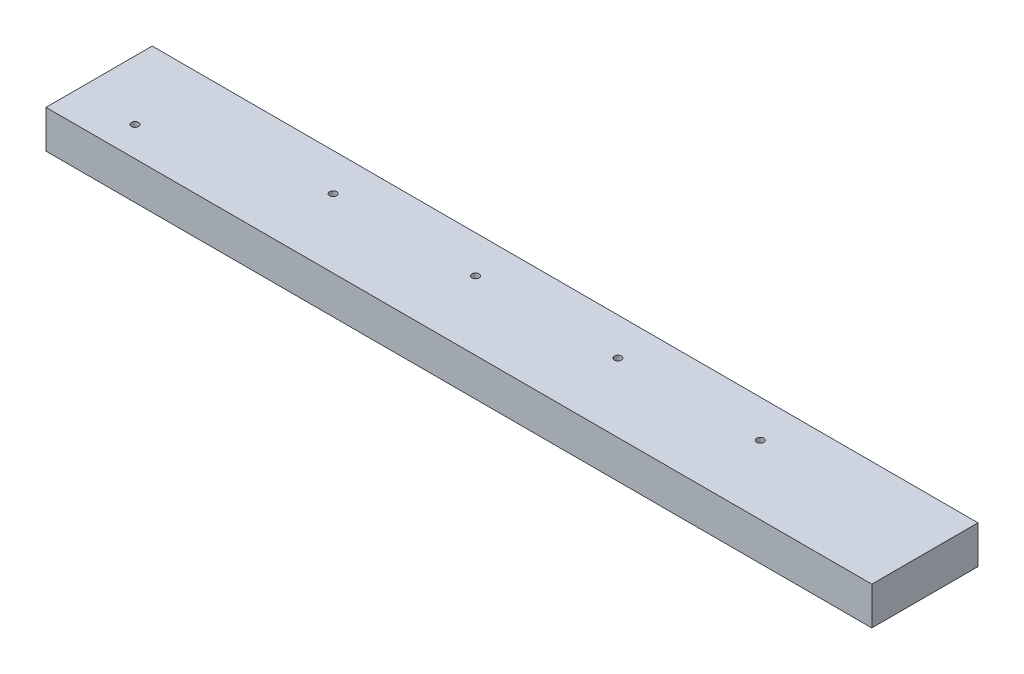
ISO-10303-21;
HEADER;
FILE_DESCRIPTION(('STEP AP214'),'2;1');
FILE_NAME('part.step','',(''),(''),'','','');
FILE_SCHEMA(('AUTOMOTIVE_DESIGN { 1 0 10303 214 1 1 1 1 }'));
ENDSEC;
DATA;
#1=APPLICATION_CONTEXT('core data for automotive mechanical design processes');
#2=APPLICATION_PROTOCOL_DEFINITION('international standard','automotive_design',2000,#1);
#3=PRODUCT_CONTEXT('',#1,'mechanical');
#4=PRODUCT('Part','Part','',(#3));
#5=PRODUCT_RELATED_PRODUCT_CATEGORY('part','',(#4));
#6=PRODUCT_DEFINITION_FORMATION('','',#4);
#7=PRODUCT_DEFINITION_CONTEXT('part definition',#1,'design');
#8=PRODUCT_DEFINITION('design','',#6,#7);
#9=PRODUCT_DEFINITION_SHAPE('','',#8);
#10=(LENGTH_UNIT() NAMED_UNIT(*) SI_UNIT(.MILLI.,.METRE.));
#11=(NAMED_UNIT(*) PLANE_ANGLE_UNIT() SI_UNIT($,.RADIAN.));
#12=(NAMED_UNIT(*) SI_UNIT($,.STERADIAN.) SOLID_ANGLE_UNIT());
#13=UNCERTAINTY_MEASURE_WITH_UNIT(LENGTH_MEASURE(1.E-05),#10,'distance_accuracy_value','');
#14=(GEOMETRIC_REPRESENTATION_CONTEXT(3) GLOBAL_UNCERTAINTY_ASSIGNED_CONTEXT((#13)) GLOBAL_UNIT_ASSIGNED_CONTEXT((#10,
#11,#12)) REPRESENTATION_CONTEXT('',''));
#15=CARTESIAN_POINT('',(0.,0.,0.));
#16=DIRECTION('',(0.,0.,1.));
#17=DIRECTION('',(1.,0.,0.));
#18=AXIS2_PLACEMENT_3D('',#15,#16,#17);
#19=CARTESIAN_POINT('',(-1104.9,50.8,-142.08125));
#20=DIRECTION('',(1.,0.,0.));
#21=DIRECTION('',(0.,0.,-1.));
#22=AXIS2_PLACEMENT_3D('',#19,#20,#21);
#23=PLANE('',#22);
#24=DIRECTION('',(0.,0.,1.));
#25=VECTOR('',#24,1.);
#26=CARTESIAN_POINT('',(-1104.9,-50.8,-142.08125));
#27=LINE('',#26,#25);
#28=CARTESIAN_POINT('',(-1104.9,-50.8,-142.08125));
#29=VERTEX_POINT('',#28);
#30=CARTESIAN_POINT('',(-1104.9,-50.8,142.08125));
#31=VERTEX_POINT('',#30);
#32=EDGE_CURVE('E217',#29,#31,#27,.T.);
#33=ORIENTED_EDGE('',*,*,#32,.T.);
#34=DIRECTION('',(0.,-1.,0.));
#35=VECTOR('',#34,1.);
#36=CARTESIAN_POINT('',(-1104.9,50.8,142.08125));
#37=LINE('',#36,#35);
#38=CARTESIAN_POINT('',(-1104.9,50.8,142.08125));
#39=VERTEX_POINT('',#38);
#40=EDGE_CURVE('E11',#39,#31,#37,.T.);
#41=ORIENTED_EDGE('',*,*,#40,.F.);
#42=DIRECTION('',(0.,0.,1.));
#43=VECTOR('',#42,1.);
#44=CARTESIAN_POINT('',(-1104.9,50.8,-142.08125));
#45=LINE('',#44,#43);
#46=CARTESIAN_POINT('',(-1104.9,50.8,-142.08125));
#47=VERTEX_POINT('',#46);
#48=EDGE_CURVE('E220',#47,#39,#45,.T.);
#49=ORIENTED_EDGE('',*,*,#48,.F.);
#50=DIRECTION('',(0.,-1.,0.));
#51=VECTOR('',#50,1.);
#52=CARTESIAN_POINT('',(-1104.9,50.8,-142.08125));
#53=LINE('',#52,#51);
#54=EDGE_CURVE('E230',#47,#29,#53,.T.);
#55=ORIENTED_EDGE('',*,*,#54,.T.);
#56=EDGE_LOOP('',(#33,#41,#49,#55));
#57=FACE_BOUND('',#56,.T.);
#58=ADVANCED_FACE('F33',(#57),#23,.F.);
#59=CARTESIAN_POINT('',(1104.9,50.8,142.08125));
#60=DIRECTION('',(0.,0.,-1.));
#61=DIRECTION('',(-1.,0.,0.));
#62=AXIS2_PLACEMENT_3D('',#59,#60,#61);
#63=PLANE('',#62);
#64=DIRECTION('',(1.,0.,0.));
#65=VECTOR('',#64,1.);
#66=CARTESIAN_POINT('',(1104.9,-50.8,142.08125));
#67=LINE('',#66,#65);
#68=CARTESIAN_POINT('',(1104.9,-50.8,142.08125));
#69=VERTEX_POINT('',#68);
#70=EDGE_CURVE('E233',#31,#69,#67,.T.);
#71=ORIENTED_EDGE('',*,*,#70,.T.);
#72=DIRECTION('',(0.,-1.,0.));
#73=VECTOR('',#72,1.);
#74=CARTESIAN_POINT('',(1104.9,50.8,142.08125));
#75=LINE('',#74,#73);
#76=CARTESIAN_POINT('',(1104.9,50.8,142.08125));
#77=VERTEX_POINT('',#76);
#78=EDGE_CURVE('E40',#77,#69,#75,.T.);
#79=ORIENTED_EDGE('',*,*,#78,.F.);
#80=DIRECTION('',(1.,0.,0.));
#81=VECTOR('',#80,1.);
#82=CARTESIAN_POINT('',(1104.9,50.8,142.08125));
#83=LINE('',#82,#81);
#84=EDGE_CURVE('E223',#39,#77,#83,.T.);
#85=ORIENTED_EDGE('',*,*,#84,.F.);
#86=ORIENTED_EDGE('',*,*,#40,.T.);
#87=EDGE_LOOP('',(#71,#79,#85,#86));
#88=FACE_BOUND('',#87,.T.);
#89=ADVANCED_FACE('F263',(#88),#63,.F.);
#90=CARTESIAN_POINT('',(1104.9,50.8,-142.08125));
#91=DIRECTION('',(-1.,0.,0.));
#92=DIRECTION('',(0.,0.,1.));
#93=AXIS2_PLACEMENT_3D('',#90,#91,#92);
#94=PLANE('',#93);
#95=DIRECTION('',(0.,0.,-1.));
#96=VECTOR('',#95,1.);
#97=CARTESIAN_POINT('',(1104.9,-50.8,-142.08125));
#98=LINE('',#97,#96);
#99=CARTESIAN_POINT('',(1104.9,-50.8,-142.08125));
#100=VERTEX_POINT('',#99);
#101=EDGE_CURVE('E235',#69,#100,#98,.T.);
#102=ORIENTED_EDGE('',*,*,#101,.T.);
#103=DIRECTION('',(0.,-1.,0.));
#104=VECTOR('',#103,1.);
#105=CARTESIAN_POINT('',(1104.9,50.8,-142.08125));
#106=LINE('',#105,#104);
#107=CARTESIAN_POINT('',(1104.9,50.8,-142.08125));
#108=VERTEX_POINT('',#107);
#109=EDGE_CURVE('E240',#108,#100,#106,.T.);
#110=ORIENTED_EDGE('',*,*,#109,.F.);
#111=DIRECTION('',(0.,0.,-1.));
#112=VECTOR('',#111,1.);
#113=CARTESIAN_POINT('',(1104.9,50.8,-142.08125));
#114=LINE('',#113,#112);
#115=EDGE_CURVE('E226',#77,#108,#114,.T.);
#116=ORIENTED_EDGE('',*,*,#115,.F.);
#117=ORIENTED_EDGE('',*,*,#78,.T.);
#118=EDGE_LOOP('',(#102,#110,#116,#117));
#119=FACE_BOUND('',#118,.T.);
#120=ADVANCED_FACE('F247',(#119),#94,.F.);
#121=CARTESIAN_POINT('',(1104.9,50.8,-142.08125));
#122=DIRECTION('',(0.,0.,1.));
#123=DIRECTION('',(1.,0.,0.));
#124=AXIS2_PLACEMENT_3D('',#121,#122,#123);
#125=PLANE('',#124);
#126=DIRECTION('',(-1.,0.,0.));
#127=VECTOR('',#126,1.);
#128=CARTESIAN_POINT('',(1104.9,-50.8,-142.08125));
#129=LINE('',#128,#127);
#130=EDGE_CURVE('E224',#100,#29,#129,.T.);
#131=ORIENTED_EDGE('',*,*,#130,.T.);
#132=ORIENTED_EDGE('',*,*,#54,.F.);
#133=DIRECTION('',(-1.,0.,0.));
#134=VECTOR('',#133,1.);
#135=CARTESIAN_POINT('',(1104.9,50.8,-142.08125));
#136=LINE('',#135,#134);
#137=EDGE_CURVE('E228',#108,#47,#136,.T.);
#138=ORIENTED_EDGE('',*,*,#137,.F.);
#139=ORIENTED_EDGE('',*,*,#109,.T.);
#140=EDGE_LOOP('',(#131,#132,#138,#139));
#141=FACE_BOUND('',#140,.T.);
#142=ADVANCED_FACE('F256',(#141),#125,.F.);
#143=CARTESIAN_POINT('',(0.,50.8,0.));
#144=DIRECTION('',(0.,-1.,0.));
#145=DIRECTION('',(0.,0.,-1.));
#146=AXIS2_PLACEMENT_3D('',#143,#144,#145);
#147=PLANE('',#146);
#148=CARTESIAN_POINT('',(-520.7,50.8,-42.0687500000002));
#149=DIRECTION('',(0.,1.,0.));
#150=DIRECTION('',(0.,0.,1.));
#151=AXIS2_PLACEMENT_3D('',#148,#149,#150);
#152=CIRCLE('',#151,9.52500000000002);
#153=CARTESIAN_POINT('',(-520.7,50.8,-32.5437500000002));
#154=VERTEX_POINT('',#153);
#155=EDGE_CURVE('E194',#154,#154,#152,.T.);
#156=ORIENTED_EDGE('',*,*,#155,.F.);
#157=EDGE_LOOP('',(#156));
#158=FACE_BOUND('',#157,.T.);
#159=CARTESIAN_POINT('',(-139.7,50.8,-42.0687500000002));
#160=DIRECTION('',(0.,1.,0.));
#161=DIRECTION('',(0.,0.,1.));
#162=AXIS2_PLACEMENT_3D('',#159,#160,#161);
#163=CIRCLE('',#162,9.52500000000002);
#164=CARTESIAN_POINT('',(-139.7,50.8,-32.5437500000002));
#165=VERTEX_POINT('',#164);
#166=EDGE_CURVE('E200',#165,#165,#163,.T.);
#167=ORIENTED_EDGE('',*,*,#166,.F.);
#168=EDGE_LOOP('',(#167));
#169=FACE_BOUND('',#168,.T.);
#170=CARTESIAN_POINT('',(241.3,50.8,-42.0687500000002));
#171=DIRECTION('',(0.,1.,0.));
#172=DIRECTION('',(0.,0.,1.));
#173=AXIS2_PLACEMENT_3D('',#170,#171,#172);
#174=CIRCLE('',#173,9.52500000000002);
#175=CARTESIAN_POINT('',(241.3,50.8,-32.5437500000002));
#176=VERTEX_POINT('',#175);
#177=EDGE_CURVE('E206',#176,#176,#174,.T.);
#178=ORIENTED_EDGE('',*,*,#177,.F.);
#179=EDGE_LOOP('',(#178));
#180=FACE_BOUND('',#179,.T.);
#181=CARTESIAN_POINT('',(622.3,50.8,-42.0687500000002));
#182=DIRECTION('',(0.,1.,0.));
#183=DIRECTION('',(0.,0.,1.));
#184=AXIS2_PLACEMENT_3D('',#181,#182,#183);
#185=CIRCLE('',#184,9.52500000000002);
#186=CARTESIAN_POINT('',(622.3,50.8,-32.5437500000002));
#187=VERTEX_POINT('',#186);
#188=EDGE_CURVE('E184',#187,#187,#185,.T.);
#189=ORIENTED_EDGE('',*,*,#188,.F.);
#190=EDGE_LOOP('',(#189));
#191=FACE_BOUND('',#190,.T.);
#192=CARTESIAN_POINT('',(-946.15,50.8,62.7062499999998));
#193=DIRECTION('',(0.,1.,0.));
#194=DIRECTION('',(0.,0.,1.));
#195=AXIS2_PLACEMENT_3D('',#192,#193,#194);
#196=CIRCLE('',#195,9.52500000000002);
#197=CARTESIAN_POINT('',(-946.15,50.8,72.2312499999998));
#198=VERTEX_POINT('',#197);
#199=EDGE_CURVE('E193',#198,#198,#196,.T.);
#200=ORIENTED_EDGE('',*,*,#199,.F.);
#201=EDGE_LOOP('',(#200));
#202=FACE_BOUND('',#201,.T.);
#203=ORIENTED_EDGE('',*,*,#48,.T.);
#204=ORIENTED_EDGE('',*,*,#84,.T.);
#205=ORIENTED_EDGE('',*,*,#115,.T.);
#206=ORIENTED_EDGE('',*,*,#137,.T.);
#207=EDGE_LOOP('',(#203,#204,#205,#206));
#208=FACE_BOUND('',#207,.T.);
#209=ADVANCED_FACE('F262',(#158,#169,#180,#191,#202,#208),#147,.F.);
#210=CARTESIAN_POINT('',(0.,-50.8,0.));
#211=DIRECTION('',(0.,-1.,0.));
#212=DIRECTION('',(0.,0.,-1.));
#213=AXIS2_PLACEMENT_3D('',#210,#211,#212);
#214=PLANE('',#213);
#215=DIRECTION('',(0.,0.,1.));
#216=VECTOR('',#215,1.);
#217=CARTESIAN_POINT('',(-619.125,-50.8,-69.0562500000085));
#218=LINE('',#217,#216);
#219=CARTESIAN_POINT('',(-619.125,-50.8,-113.506250000008));
#220=VERTEX_POINT('',#219);
#221=CARTESIAN_POINT('',(-619.125,-50.8,-69.0562500000085));
#222=VERTEX_POINT('',#221);
#223=EDGE_CURVE('E47',#220,#222,#218,.T.);
#224=ORIENTED_EDGE('',*,*,#223,.F.);
#225=DIRECTION('',(1.,0.,0.));
#226=VECTOR('',#225,1.);
#227=CARTESIAN_POINT('',(-704.85,-50.8,-113.506250000008));
#228=LINE('',#227,#226);
#229=CARTESIAN_POINT('',(-704.85,-50.8,-113.506250000008));
#230=VERTEX_POINT('',#229);
#231=EDGE_CURVE('E141',#230,#220,#228,.T.);
#232=ORIENTED_EDGE('',*,*,#231,.F.);
#233=DIRECTION('',(0.,0.,-1.));
#234=VECTOR('',#233,1.);
#235=CARTESIAN_POINT('',(-704.85,-50.8,-69.0562500000085));
#236=LINE('',#235,#234);
#237=CARTESIAN_POINT('',(-704.85,-50.8,-69.0562500000085));
#238=VERTEX_POINT('',#237);
#239=EDGE_CURVE('E144',#238,#230,#236,.T.);
#240=ORIENTED_EDGE('',*,*,#239,.F.);
#241=DIRECTION('',(-1.,0.,0.));
#242=VECTOR('',#241,1.);
#243=CARTESIAN_POINT('',(-704.85,-50.8,-69.0562500000085));
#244=LINE('',#243,#242);
#245=EDGE_CURVE('E150',#222,#238,#244,.T.);
#246=ORIENTED_EDGE('',*,*,#245,.F.);
#247=EDGE_LOOP('',(#224,#232,#240,#246));
#248=FACE_BOUND('',#247,.T.);
#249=DIRECTION('',(0.,0.,1.));
#250=VECTOR('',#249,1.);
#251=CARTESIAN_POINT('',(574.675,-50.8,-69.0562500000001));
#252=LINE('',#251,#250);
#253=CARTESIAN_POINT('',(574.675,-50.8,-113.50625));
#254=VERTEX_POINT('',#253);
#255=CARTESIAN_POINT('',(574.675,-50.8,-69.0562500000001));
#256=VERTEX_POINT('',#255);
#257=EDGE_CURVE('E55',#254,#256,#252,.T.);
#258=ORIENTED_EDGE('',*,*,#257,.F.);
#259=DIRECTION('',(1.,0.,0.));
#260=VECTOR('',#259,1.);
#261=CARTESIAN_POINT('',(488.95,-50.8,-113.50625));
#262=LINE('',#261,#260);
#263=CARTESIAN_POINT('',(488.95,-50.8,-113.50625));
#264=VERTEX_POINT('',#263);
#265=EDGE_CURVE('E163',#264,#254,#262,.T.);
#266=ORIENTED_EDGE('',*,*,#265,.F.);
#267=DIRECTION('',(0.,0.,-1.));
#268=VECTOR('',#267,1.);
#269=CARTESIAN_POINT('',(488.95,-50.8,-69.0562500000001));
#270=LINE('',#269,#268);
#271=CARTESIAN_POINT('',(488.95,-50.8,-69.0562500000001));
#272=VERTEX_POINT('',#271);
#273=EDGE_CURVE('E177',#272,#264,#270,.T.);
#274=ORIENTED_EDGE('',*,*,#273,.F.);
#275=DIRECTION('',(-1.,0.,0.));
#276=VECTOR('',#275,1.);
#277=CARTESIAN_POINT('',(488.95,-50.8,-69.0562500000001));
#278=LINE('',#277,#276);
#279=EDGE_CURVE('E174',#256,#272,#278,.T.);
#280=ORIENTED_EDGE('',*,*,#279,.F.);
#281=EDGE_LOOP('',(#258,#266,#274,#280));
#282=FACE_BOUND('',#281,.T.);
#283=CARTESIAN_POINT('',(-520.7,-50.8,-42.0687500000002));
#284=DIRECTION('',(0.,1.,0.));
#285=DIRECTION('',(0.,0.,1.));
#286=AXIS2_PLACEMENT_3D('',#283,#284,#285);
#287=CIRCLE('',#286,9.52500000000002);
#288=CARTESIAN_POINT('',(-520.7,-50.8,-32.5437500000002));
#289=VERTEX_POINT('',#288);
#290=EDGE_CURVE('E190',#289,#289,#287,.T.);
#291=ORIENTED_EDGE('',*,*,#290,.T.);
#292=EDGE_LOOP('',(#291));
#293=FACE_BOUND('',#292,.T.);
#294=CARTESIAN_POINT('',(-139.7,-50.8,-42.0687500000002));
#295=DIRECTION('',(0.,1.,0.));
#296=DIRECTION('',(0.,0.,1.));
#297=AXIS2_PLACEMENT_3D('',#294,#295,#296);
#298=CIRCLE('',#297,9.52500000000002);
#299=CARTESIAN_POINT('',(-139.7,-50.8,-32.5437500000002));
#300=VERTEX_POINT('',#299);
#301=EDGE_CURVE('E197',#300,#300,#298,.T.);
#302=ORIENTED_EDGE('',*,*,#301,.T.);
#303=EDGE_LOOP('',(#302));
#304=FACE_BOUND('',#303,.T.);
#305=CARTESIAN_POINT('',(241.3,-50.8,-42.0687500000002));
#306=DIRECTION('',(0.,1.,0.));
#307=DIRECTION('',(0.,0.,1.));
#308=AXIS2_PLACEMENT_3D('',#305,#306,#307);
#309=CIRCLE('',#308,9.52500000000002);
#310=CARTESIAN_POINT('',(241.3,-50.8,-32.5437500000002));
#311=VERTEX_POINT('',#310);
#312=EDGE_CURVE('E203',#311,#311,#309,.T.);
#313=ORIENTED_EDGE('',*,*,#312,.T.);
#314=EDGE_LOOP('',(#313));
#315=FACE_BOUND('',#314,.T.);
#316=CARTESIAN_POINT('',(622.3,-50.8,-42.0687500000002));
#317=DIRECTION('',(0.,1.,0.));
#318=DIRECTION('',(0.,0.,1.));
#319=AXIS2_PLACEMENT_3D('',#316,#317,#318);
#320=CIRCLE('',#319,9.52500000000002);
#321=CARTESIAN_POINT('',(622.3,-50.8,-32.5437500000002));
#322=VERTEX_POINT('',#321);
#323=EDGE_CURVE('E209',#322,#322,#320,.T.);
#324=ORIENTED_EDGE('',*,*,#323,.T.);
#325=EDGE_LOOP('',(#324));
#326=FACE_BOUND('',#325,.T.);
#327=CARTESIAN_POINT('',(-946.15,-50.8,62.7062499999998));
#328=DIRECTION('',(0.,1.,0.));
#329=DIRECTION('',(0.,0.,1.));
#330=AXIS2_PLACEMENT_3D('',#327,#328,#329);
#331=CIRCLE('',#330,9.52500000000002);
#332=CARTESIAN_POINT('',(-946.15,-50.8,72.2312499999998));
#333=VERTEX_POINT('',#332);
#334=EDGE_CURVE('E214',#333,#333,#331,.T.);
#335=ORIENTED_EDGE('',*,*,#334,.T.);
#336=EDGE_LOOP('',(#335));
#337=FACE_BOUND('',#336,.T.);
#338=ORIENTED_EDGE('',*,*,#32,.F.);
#339=ORIENTED_EDGE('',*,*,#130,.F.);
#340=ORIENTED_EDGE('',*,*,#101,.F.);
#341=ORIENTED_EDGE('',*,*,#70,.F.);
#342=EDGE_LOOP('',(#338,#339,#340,#341));
#343=FACE_BOUND('',#342,.T.);
#344=ADVANCED_FACE('F253',(#248,#282,#293,#304,#315,#326,#337,#343),#214,.T.);
#345=CARTESIAN_POINT('',(-946.15,-50.8,62.7062499999998));
#346=DIRECTION('',(0.,1.,0.));
#347=DIRECTION('',(0.,0.,1.));
#348=AXIS2_PLACEMENT_3D('',#345,#346,#347);
#349=CYLINDRICAL_SURFACE('',#348,9.52500000000002);
#350=ORIENTED_EDGE('',*,*,#334,.F.);
#351=EDGE_LOOP('',(#350));
#352=FACE_BOUND('',#351,.T.);
#353=ORIENTED_EDGE('',*,*,#199,.T.);
#354=EDGE_LOOP('',(#353));
#355=FACE_BOUND('',#354,.T.);
#356=ADVANCED_FACE('F275',(#352,#355),#349,.F.);
#357=CARTESIAN_POINT('',(622.3,-50.8,-42.0687500000002));
#358=DIRECTION('',(0.,1.,0.));
#359=DIRECTION('',(0.,0.,1.));
#360=AXIS2_PLACEMENT_3D('',#357,#358,#359);
#361=CYLINDRICAL_SURFACE('',#360,9.52500000000002);
#362=ORIENTED_EDGE('',*,*,#323,.F.);
#363=EDGE_LOOP('',(#362));
#364=FACE_BOUND('',#363,.T.);
#365=ORIENTED_EDGE('',*,*,#188,.T.);
#366=EDGE_LOOP('',(#365));
#367=FACE_BOUND('',#366,.T.);
#368=ADVANCED_FACE('F282',(#364,#367),#361,.F.);
#369=CARTESIAN_POINT('',(241.3,-50.8,-42.0687500000002));
#370=DIRECTION('',(0.,1.,0.));
#371=DIRECTION('',(0.,0.,1.));
#372=AXIS2_PLACEMENT_3D('',#369,#370,#371);
#373=CYLINDRICAL_SURFACE('',#372,9.52500000000002);
#374=ORIENTED_EDGE('',*,*,#312,.F.);
#375=EDGE_LOOP('',(#374));
#376=FACE_BOUND('',#375,.T.);
#377=ORIENTED_EDGE('',*,*,#177,.T.);
#378=EDGE_LOOP('',(#377));
#379=FACE_BOUND('',#378,.T.);
#380=ADVANCED_FACE('F286',(#376,#379),#373,.F.);
#381=CARTESIAN_POINT('',(-139.7,-50.8,-42.0687500000002));
#382=DIRECTION('',(0.,1.,0.));
#383=DIRECTION('',(0.,0.,1.));
#384=AXIS2_PLACEMENT_3D('',#381,#382,#383);
#385=CYLINDRICAL_SURFACE('',#384,9.52500000000002);
#386=ORIENTED_EDGE('',*,*,#301,.F.);
#387=EDGE_LOOP('',(#386));
#388=FACE_BOUND('',#387,.T.);
#389=ORIENTED_EDGE('',*,*,#166,.T.);
#390=EDGE_LOOP('',(#389));
#391=FACE_BOUND('',#390,.T.);
#392=ADVANCED_FACE('F290',(#388,#391),#385,.F.);
#393=CARTESIAN_POINT('',(-520.7,-50.8,-42.0687500000002));
#394=DIRECTION('',(0.,1.,0.));
#395=DIRECTION('',(0.,0.,1.));
#396=AXIS2_PLACEMENT_3D('',#393,#394,#395);
#397=CYLINDRICAL_SURFACE('',#396,9.52500000000002);
#398=ORIENTED_EDGE('',*,*,#290,.F.);
#399=EDGE_LOOP('',(#398));
#400=FACE_BOUND('',#399,.T.);
#401=ORIENTED_EDGE('',*,*,#155,.T.);
#402=EDGE_LOOP('',(#401));
#403=FACE_BOUND('',#402,.T.);
#404=ADVANCED_FACE('F294',(#400,#403),#397,.F.);
#405=CARTESIAN_POINT('',(574.675,-25.4,-69.0562500000001));
#406=DIRECTION('',(1.,0.,0.));
#407=DIRECTION('',(0.,0.,-1.));
#408=AXIS2_PLACEMENT_3D('',#405,#406,#407);
#409=PLANE('',#408);
#410=ORIENTED_EDGE('',*,*,#257,.T.);
#411=DIRECTION('',(0.,-1.,0.));
#412=VECTOR('',#411,1.);
#413=CARTESIAN_POINT('',(574.675,-25.4,-69.0562500000001));
#414=LINE('',#413,#412);
#415=CARTESIAN_POINT('',(574.675,-25.4,-69.0562500000001));
#416=VERTEX_POINT('',#415);
#417=EDGE_CURVE('E172',#416,#256,#414,.T.);
#418=ORIENTED_EDGE('',*,*,#417,.F.);
#419=DIRECTION('',(0.,0.,1.));
#420=VECTOR('',#419,1.);
#421=CARTESIAN_POINT('',(574.675,-25.4,-69.0562500000001));
#422=LINE('',#421,#420);
#423=CARTESIAN_POINT('',(574.675,-25.4,-113.50625));
#424=VERTEX_POINT('',#423);
#425=EDGE_CURVE('E159',#424,#416,#422,.T.);
#426=ORIENTED_EDGE('',*,*,#425,.F.);
#427=DIRECTION('',(0.,-1.,0.));
#428=VECTOR('',#427,1.);
#429=CARTESIAN_POINT('',(574.675,-25.4,-113.50625));
#430=LINE('',#429,#428);
#431=EDGE_CURVE('E182',#424,#254,#430,.T.);
#432=ORIENTED_EDGE('',*,*,#431,.T.);
#433=EDGE_LOOP('',(#410,#418,#426,#432));
#434=FACE_BOUND('',#433,.T.);
#435=ADVANCED_FACE('F298',(#434),#409,.F.);
#436=CARTESIAN_POINT('',(488.95,-25.4,-113.50625));
#437=DIRECTION('',(0.,0.,-1.));
#438=DIRECTION('',(-1.,0.,0.));
#439=AXIS2_PLACEMENT_3D('',#436,#437,#438);
#440=PLANE('',#439);
#441=ORIENTED_EDGE('',*,*,#265,.T.);
#442=ORIENTED_EDGE('',*,*,#431,.F.);
#443=DIRECTION('',(1.,0.,0.));
#444=VECTOR('',#443,1.);
#445=CARTESIAN_POINT('',(488.95,-25.4,-113.50625));
#446=LINE('',#445,#444);
#447=CARTESIAN_POINT('',(488.95,-25.4,-113.50625));
#448=VERTEX_POINT('',#447);
#449=EDGE_CURVE('E169',#448,#424,#446,.T.);
#450=ORIENTED_EDGE('',*,*,#449,.F.);
#451=DIRECTION('',(0.,-1.,0.));
#452=VECTOR('',#451,1.);
#453=CARTESIAN_POINT('',(488.95,-25.4,-113.50625));
#454=LINE('',#453,#452);
#455=EDGE_CURVE('E185',#448,#264,#454,.T.);
#456=ORIENTED_EDGE('',*,*,#455,.T.);
#457=EDGE_LOOP('',(#441,#442,#450,#456));
#458=FACE_BOUND('',#457,.T.);
#459=ADVANCED_FACE('F302',(#458),#440,.F.);
#460=CARTESIAN_POINT('',(488.95,-25.4,-69.0562500000001));
#461=DIRECTION('',(-1.,0.,0.));
#462=DIRECTION('',(0.,0.,1.));
#463=AXIS2_PLACEMENT_3D('',#460,#461,#462);
#464=PLANE('',#463);
#465=ORIENTED_EDGE('',*,*,#273,.T.);
#466=ORIENTED_EDGE('',*,*,#455,.F.);
#467=DIRECTION('',(0.,0.,-1.));
#468=VECTOR('',#467,1.);
#469=CARTESIAN_POINT('',(488.95,-25.4,-69.0562500000001));
#470=LINE('',#469,#468);
#471=CARTESIAN_POINT('',(488.95,-25.4,-69.0562500000001));
#472=VERTEX_POINT('',#471);
#473=EDGE_CURVE('E166',#472,#448,#470,.T.);
#474=ORIENTED_EDGE('',*,*,#473,.F.);
#475=DIRECTION('',(0.,-1.,0.));
#476=VECTOR('',#475,1.);
#477=CARTESIAN_POINT('',(488.95,-25.4,-69.0562500000001));
#478=LINE('',#477,#476);
#479=EDGE_CURVE('E187',#472,#272,#478,.T.);
#480=ORIENTED_EDGE('',*,*,#479,.T.);
#481=EDGE_LOOP('',(#465,#466,#474,#480));
#482=FACE_BOUND('',#481,.T.);
#483=ADVANCED_FACE('F307',(#482),#464,.F.);
#484=CARTESIAN_POINT('',(488.95,-25.4,-69.0562500000001));
#485=DIRECTION('',(0.,0.,1.));
#486=DIRECTION('',(1.,0.,0.));
#487=AXIS2_PLACEMENT_3D('',#484,#485,#486);
#488=PLANE('',#487);
#489=ORIENTED_EDGE('',*,*,#279,.T.);
#490=ORIENTED_EDGE('',*,*,#479,.F.);
#491=DIRECTION('',(-1.,0.,0.));
#492=VECTOR('',#491,1.);
#493=CARTESIAN_POINT('',(488.95,-25.4,-69.0562500000001));
#494=LINE('',#493,#492);
#495=EDGE_CURVE('E162',#416,#472,#494,.T.);
#496=ORIENTED_EDGE('',*,*,#495,.F.);
#497=ORIENTED_EDGE('',*,*,#417,.T.);
#498=EDGE_LOOP('',(#489,#490,#496,#497));
#499=FACE_BOUND('',#498,.T.);
#500=ADVANCED_FACE('F303',(#499),#488,.F.);
#501=CARTESIAN_POINT('',(0.,-25.4,0.));
#502=DIRECTION('',(0.,-1.,0.));
#503=DIRECTION('',(0.,0.,-1.));
#504=AXIS2_PLACEMENT_3D('',#501,#502,#503);
#505=PLANE('',#504);
#506=ORIENTED_EDGE('',*,*,#425,.T.);
#507=ORIENTED_EDGE('',*,*,#495,.T.);
#508=ORIENTED_EDGE('',*,*,#473,.T.);
#509=ORIENTED_EDGE('',*,*,#449,.T.);
#510=EDGE_LOOP('',(#506,#507,#508,#509));
#511=FACE_BOUND('',#510,.T.);
#512=ADVANCED_FACE('F306',(#511),#505,.T.);
#513=CARTESIAN_POINT('',(-619.125,-25.4,-69.0562500000085));
#514=DIRECTION('',(1.,0.,0.));
#515=DIRECTION('',(0.,0.,-1.));
#516=AXIS2_PLACEMENT_3D('',#513,#514,#515);
#517=PLANE('',#516);
#518=ORIENTED_EDGE('',*,*,#223,.T.);
#519=DIRECTION('',(0.,-1.,0.));
#520=VECTOR('',#519,1.);
#521=CARTESIAN_POINT('',(-619.125,-25.4,-69.0562500000085));
#522=LINE('',#521,#520);
#523=CARTESIAN_POINT('',(-619.125,-25.4,-69.0562500000085));
#524=VERTEX_POINT('',#523);
#525=EDGE_CURVE('E119',#524,#222,#522,.T.);
#526=ORIENTED_EDGE('',*,*,#525,.F.);
#527=DIRECTION('',(0.,0.,1.));
#528=VECTOR('',#527,1.);
#529=CARTESIAN_POINT('',(-619.125,-25.4,-69.0562500000085));
#530=LINE('',#529,#528);
#531=CARTESIAN_POINT('',(-619.125,-25.4,-113.506250000008));
#532=VERTEX_POINT('',#531);
#533=EDGE_CURVE('E123',#532,#524,#530,.T.);
#534=ORIENTED_EDGE('',*,*,#533,.F.);
#535=DIRECTION('',(0.,-1.,0.));
#536=VECTOR('',#535,1.);
#537=CARTESIAN_POINT('',(-619.125,-25.4,-113.506250000008));
#538=LINE('',#537,#536);
#539=EDGE_CURVE('E154',#532,#220,#538,.T.);
#540=ORIENTED_EDGE('',*,*,#539,.T.);
#541=EDGE_LOOP('',(#518,#526,#534,#540));
#542=FACE_BOUND('',#541,.T.);
#543=ADVANCED_FACE('F121',(#542),#517,.F.);
#544=CARTESIAN_POINT('',(-704.85,-25.4,-113.506250000008));
#545=DIRECTION('',(0.,0.,-1.));
#546=DIRECTION('',(-1.,0.,0.));
#547=AXIS2_PLACEMENT_3D('',#544,#545,#546);
#548=PLANE('',#547);
#549=ORIENTED_EDGE('',*,*,#231,.T.);
#550=ORIENTED_EDGE('',*,*,#539,.F.);
#551=DIRECTION('',(1.,0.,0.));
#552=VECTOR('',#551,1.);
#553=CARTESIAN_POINT('',(-704.85,-25.4,-113.506250000008));
#554=LINE('',#553,#552);
#555=CARTESIAN_POINT('',(-704.85,-25.4,-113.506250000008));
#556=VERTEX_POINT('',#555);
#557=EDGE_CURVE('E129',#556,#532,#554,.T.);
#558=ORIENTED_EDGE('',*,*,#557,.F.);
#559=DIRECTION('',(0.,-1.,0.));
#560=VECTOR('',#559,1.);
#561=CARTESIAN_POINT('',(-704.85,-25.4,-113.506250000008));
#562=LINE('',#561,#560);
#563=EDGE_CURVE('E156',#556,#230,#562,.T.);
#564=ORIENTED_EDGE('',*,*,#563,.T.);
#565=EDGE_LOOP('',(#549,#550,#558,#564));
#566=FACE_BOUND('',#565,.T.);
#567=ADVANCED_FACE('F320',(#566),#548,.F.);
#568=CARTESIAN_POINT('',(-704.85,-25.4,-69.0562500000085));
#569=DIRECTION('',(-1.,0.,0.));
#570=DIRECTION('',(0.,0.,1.));
#571=AXIS2_PLACEMENT_3D('',#568,#569,#570);
#572=PLANE('',#571);
#573=ORIENTED_EDGE('',*,*,#239,.T.);
#574=ORIENTED_EDGE('',*,*,#563,.F.);
#575=DIRECTION('',(0.,0.,-1.));
#576=VECTOR('',#575,1.);
#577=CARTESIAN_POINT('',(-704.85,-25.4,-69.0562500000085));
#578=LINE('',#577,#576);
#579=CARTESIAN_POINT('',(-704.85,-25.4,-69.0562500000085));
#580=VERTEX_POINT('',#579);
#581=EDGE_CURVE('E137',#580,#556,#578,.T.);
#582=ORIENTED_EDGE('',*,*,#581,.F.);
#583=DIRECTION('',(0.,-1.,0.));
#584=VECTOR('',#583,1.);
#585=CARTESIAN_POINT('',(-704.85,-25.4,-69.0562500000085));
#586=LINE('',#585,#584);
#587=EDGE_CURVE('E128',#580,#238,#586,.T.);
#588=ORIENTED_EDGE('',*,*,#587,.T.);
#589=EDGE_LOOP('',(#573,#574,#582,#588));
#590=FACE_BOUND('',#589,.T.);
#591=ADVANCED_FACE('F323',(#590),#572,.F.);
#592=CARTESIAN_POINT('',(-704.85,-25.4,-69.0562500000085));
#593=DIRECTION('',(0.,0.,1.));
#594=DIRECTION('',(1.,0.,0.));
#595=AXIS2_PLACEMENT_3D('',#592,#593,#594);
#596=PLANE('',#595);
#597=ORIENTED_EDGE('',*,*,#245,.T.);
#598=ORIENTED_EDGE('',*,*,#587,.F.);
#599=DIRECTION('',(-1.,0.,0.));
#600=VECTOR('',#599,1.);
#601=CARTESIAN_POINT('',(-704.85,-25.4,-69.0562500000085));
#602=LINE('',#601,#600);
#603=EDGE_CURVE('E132',#524,#580,#602,.T.);
#604=ORIENTED_EDGE('',*,*,#603,.F.);
#605=ORIENTED_EDGE('',*,*,#525,.T.);
#606=EDGE_LOOP('',(#597,#598,#604,#605));
#607=FACE_BOUND('',#606,.T.);
#608=ADVANCED_FACE('F133',(#607),#596,.F.);
#609=CARTESIAN_POINT('',(0.,-25.4,0.));
#610=DIRECTION('',(0.,-1.,0.));
#611=DIRECTION('',(0.,0.,-1.));
#612=AXIS2_PLACEMENT_3D('',#609,#610,#611);
#613=PLANE('',#612);
#614=ORIENTED_EDGE('',*,*,#533,.T.);
#615=ORIENTED_EDGE('',*,*,#603,.T.);
#616=ORIENTED_EDGE('',*,*,#581,.T.);
#617=ORIENTED_EDGE('',*,*,#557,.T.);
#618=EDGE_LOOP('',(#614,#615,#616,#617));
#619=FACE_BOUND('',#618,.T.);
#620=ADVANCED_FACE('F139',(#619),#613,.T.);
#621=CLOSED_SHELL('',(#58,#89,#120,#142,#209,#344,#356,#368,#380,#392,#404,#435,#459,#483,#500,
#512,#543,#567,#591,#608,#620));
#622=MANIFOLD_SOLID_BREP('B2',#621);
#623=ADVANCED_BREP_SHAPE_REPRESENTATION('',(#18,#622),#14);
#624=SHAPE_DEFINITION_REPRESENTATION(#9,#623);
ENDSEC;
END-ISO-10303-21;
